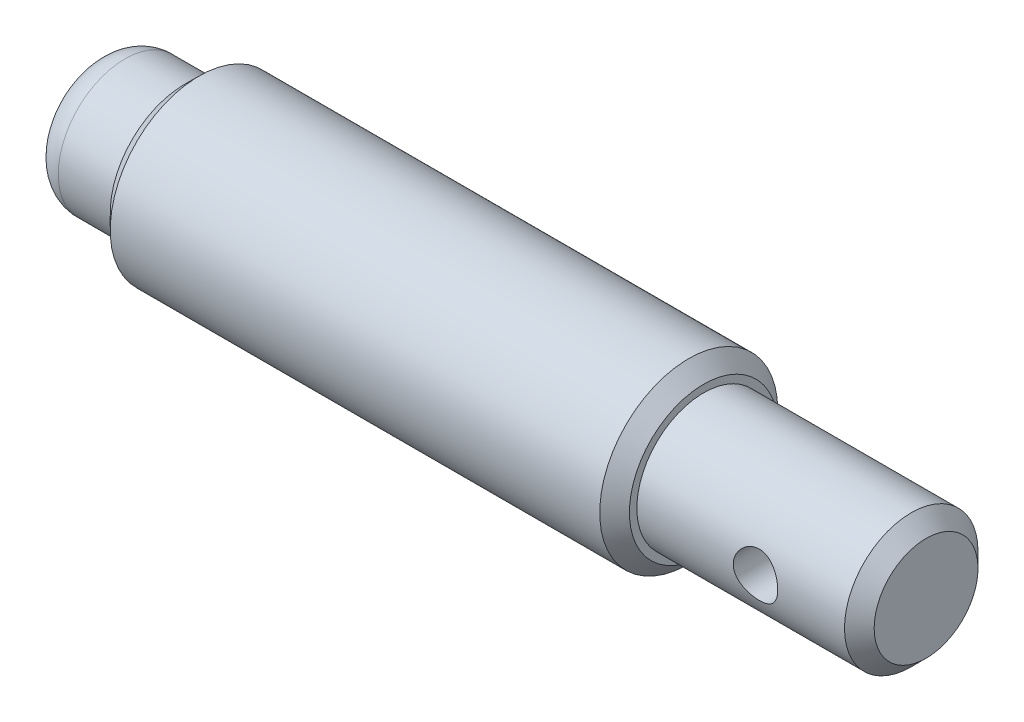
ISO-10303-21;
HEADER;
FILE_DESCRIPTION(('STEP AP214'),'2;1');
FILE_NAME('part.step','',(''),(''),'','','');
FILE_SCHEMA(('AUTOMOTIVE_DESIGN { 1 0 10303 214 1 1 1 1 }'));
ENDSEC;
DATA;
#1=APPLICATION_CONTEXT('core data for automotive mechanical design processes');
#2=APPLICATION_PROTOCOL_DEFINITION('international standard','automotive_design',2000,#1);
#3=PRODUCT_CONTEXT('',#1,'mechanical');
#4=PRODUCT('Part','Part','',(#3));
#5=PRODUCT_RELATED_PRODUCT_CATEGORY('part','',(#4));
#6=PRODUCT_DEFINITION_FORMATION('','',#4);
#7=PRODUCT_DEFINITION_CONTEXT('part definition',#1,'design');
#8=PRODUCT_DEFINITION('design','',#6,#7);
#9=PRODUCT_DEFINITION_SHAPE('','',#8);
#10=(LENGTH_UNIT() NAMED_UNIT(*) SI_UNIT(.MILLI.,.METRE.));
#11=(NAMED_UNIT(*) PLANE_ANGLE_UNIT() SI_UNIT($,.RADIAN.));
#12=(NAMED_UNIT(*) SI_UNIT($,.STERADIAN.) SOLID_ANGLE_UNIT());
#13=UNCERTAINTY_MEASURE_WITH_UNIT(LENGTH_MEASURE(1.E-05),#10,'distance_accuracy_value','');
#14=(GEOMETRIC_REPRESENTATION_CONTEXT(3) GLOBAL_UNCERTAINTY_ASSIGNED_CONTEXT((#13)) GLOBAL_UNIT_ASSIGNED_CONTEXT((#10,
#11,#12)) REPRESENTATION_CONTEXT('',''));
#15=CARTESIAN_POINT('',(0.,0.,0.));
#16=DIRECTION('',(0.,0.,1.));
#17=DIRECTION('',(1.,0.,0.));
#18=AXIS2_PLACEMENT_3D('',#15,#16,#17);
#19=CARTESIAN_POINT('',(0.,0.,0.));
#20=DIRECTION('',(-0.999999999999995,0.,0.));
#21=DIRECTION('',(0.,0.,0.999999999999995));
#22=AXIS2_PLACEMENT_3D('',#19,#20,#21);
#23=PLANE('',#22);
#24=CARTESIAN_POINT('',(0.,0.,0.));
#25=DIRECTION('',(-0.999999999999995,0.,0.));
#26=DIRECTION('',(0.,0.,0.999999999999995));
#27=AXIS2_PLACEMENT_3D('',#24,#25,#26);
#28=CIRCLE('',#27,2.5);
#29=CARTESIAN_POINT('',(0.,0.,2.49999999999999));
#30=VERTEX_POINT('',#29);
#31=EDGE_CURVE('E58',#30,#30,#28,.T.);
#32=ORIENTED_EDGE('',*,*,#31,.T.);
#33=EDGE_LOOP('',(#32));
#34=FACE_BOUND('',#33,.T.);
#35=ADVANCED_FACE('F45',(#34),#23,.T.);
#36=CARTESIAN_POINT('',(0.,0.,0.));
#37=DIRECTION('',(0.999999999999995,0.,0.));
#38=DIRECTION('',(0.,0.,-0.999999999999995));
#39=AXIS2_PLACEMENT_3D('',#36,#37,#38);
#40=CYLINDRICAL_SURFACE('',#39,4.5);
#41=CARTESIAN_POINT('',(1.99999999999979,0.,0.));
#42=DIRECTION('',(-0.999999999999995,0.,0.));
#43=DIRECTION('',(0.,0.,0.999999999999995));
#44=AXIS2_PLACEMENT_3D('',#41,#42,#43);
#45=CIRCLE('',#44,4.5);
#46=CARTESIAN_POINT('',(1.99999999999979,0.,-4.49999999999998));
#47=VERTEX_POINT('',#46);
#48=EDGE_CURVE('E62',#47,#47,#45,.F.);
#49=CARTESIAN_POINT('',(5.99999999999979,0.,0.));
#50=DIRECTION('',(0.999999999999995,0.,0.));
#51=DIRECTION('',(0.,0.,-0.999999999999995));
#52=AXIS2_PLACEMENT_3D('',#49,#50,#51);
#53=CIRCLE('',#52,4.5);
#54=CARTESIAN_POINT('',(5.99999999999979,0.,-4.49999999999998));
#55=VERTEX_POINT('',#54);
#56=EDGE_CURVE('E136',#55,#55,#53,.T.);
#57=CARTESIAN_POINT('',(1.99999999999979,0.,-4.49999999999998));
#58=CARTESIAN_POINT('',(2.04166666666645,0.,-4.49999999999998));
#59=CARTESIAN_POINT('',(2.08333333333312,0.,-4.49999999999998));
#60=CARTESIAN_POINT('',(2.16666666666645,0.,-4.49999999999998));
#61=CARTESIAN_POINT('',(2.20833333333312,0.,-4.49999999999998));
#62=CARTESIAN_POINT('',(2.29166666666645,0.,-4.49999999999998));
#63=CARTESIAN_POINT('',(2.33333333333312,0.,-4.49999999999998));
#64=CARTESIAN_POINT('',(2.41666666666645,0.,-4.49999999999998));
#65=CARTESIAN_POINT('',(2.45833333333312,0.,-4.49999999999998));
#66=CARTESIAN_POINT('',(2.54166666666645,0.,-4.49999999999998));
#67=CARTESIAN_POINT('',(2.58333333333312,0.,-4.49999999999998));
#68=CARTESIAN_POINT('',(2.66666666666645,0.,-4.49999999999998));
#69=CARTESIAN_POINT('',(2.70833333333312,0.,-4.49999999999998));
#70=CARTESIAN_POINT('',(2.79166666666645,0.,-4.49999999999998));
#71=CARTESIAN_POINT('',(2.83333333333312,0.,-4.49999999999998));
#72=CARTESIAN_POINT('',(2.91666666666645,0.,-4.49999999999998));
#73=CARTESIAN_POINT('',(2.95833333333312,0.,-4.49999999999998));
#74=CARTESIAN_POINT('',(3.04166666666645,0.,-4.49999999999998));
#75=CARTESIAN_POINT('',(3.08333333333312,0.,-4.49999999999998));
#76=CARTESIAN_POINT('',(3.16666666666645,0.,-4.49999999999998));
#77=CARTESIAN_POINT('',(3.20833333333312,0.,-4.49999999999998));
#78=CARTESIAN_POINT('',(3.29166666666645,0.,-4.49999999999998));
#79=CARTESIAN_POINT('',(3.33333333333312,0.,-4.49999999999998));
#80=CARTESIAN_POINT('',(3.41666666666645,0.,-4.49999999999998));
#81=CARTESIAN_POINT('',(3.45833333333312,0.,-4.49999999999998));
#82=CARTESIAN_POINT('',(3.54166666666645,0.,-4.49999999999998));
#83=CARTESIAN_POINT('',(3.58333333333312,0.,-4.49999999999998));
#84=CARTESIAN_POINT('',(3.66666666666645,0.,-4.49999999999998));
#85=CARTESIAN_POINT('',(3.70833333333312,0.,-4.49999999999998));
#86=CARTESIAN_POINT('',(3.79166666666645,0.,-4.49999999999998));
#87=CARTESIAN_POINT('',(3.83333333333312,0.,-4.49999999999998));
#88=CARTESIAN_POINT('',(3.91666666666645,0.,-4.49999999999998));
#89=CARTESIAN_POINT('',(3.95833333333312,0.,-4.49999999999998));
#90=CARTESIAN_POINT('',(4.04166666666645,0.,-4.49999999999998));
#91=CARTESIAN_POINT('',(4.08333333333312,0.,-4.49999999999998));
#92=CARTESIAN_POINT('',(4.16666666666645,0.,-4.49999999999998));
#93=CARTESIAN_POINT('',(4.20833333333312,0.,-4.49999999999998));
#94=CARTESIAN_POINT('',(4.29166666666645,0.,-4.49999999999998));
#95=CARTESIAN_POINT('',(4.33333333333312,0.,-4.49999999999998));
#96=CARTESIAN_POINT('',(4.41666666666645,0.,-4.49999999999998));
#97=CARTESIAN_POINT('',(4.45833333333312,0.,-4.49999999999998));
#98=CARTESIAN_POINT('',(4.54166666666645,0.,-4.49999999999998));
#99=CARTESIAN_POINT('',(4.58333333333312,0.,-4.49999999999998));
#100=CARTESIAN_POINT('',(4.66666666666645,0.,-4.49999999999998));
#101=CARTESIAN_POINT('',(4.70833333333312,0.,-4.49999999999998));
#102=CARTESIAN_POINT('',(4.79166666666645,0.,-4.49999999999998));
#103=CARTESIAN_POINT('',(4.83333333333312,0.,-4.49999999999998));
#104=CARTESIAN_POINT('',(4.91666666666645,0.,-4.49999999999998));
#105=CARTESIAN_POINT('',(4.95833333333312,0.,-4.49999999999998));
#106=CARTESIAN_POINT('',(5.04166666666645,0.,-4.49999999999998));
#107=CARTESIAN_POINT('',(5.08333333333312,0.,-4.49999999999998));
#108=CARTESIAN_POINT('',(5.16666666666645,0.,-4.49999999999998));
#109=CARTESIAN_POINT('',(5.20833333333312,0.,-4.49999999999998));
#110=CARTESIAN_POINT('',(5.29166666666645,0.,-4.49999999999998));
#111=CARTESIAN_POINT('',(5.33333333333312,0.,-4.49999999999998));
#112=CARTESIAN_POINT('',(5.41666666666645,0.,-4.49999999999998));
#113=CARTESIAN_POINT('',(5.45833333333312,0.,-4.49999999999998));
#114=CARTESIAN_POINT('',(5.54166666666645,0.,-4.49999999999998));
#115=CARTESIAN_POINT('',(5.58333333333312,0.,-4.49999999999998));
#116=CARTESIAN_POINT('',(5.66666666666645,0.,-4.49999999999998));
#117=CARTESIAN_POINT('',(5.70833333333312,0.,-4.49999999999998));
#118=CARTESIAN_POINT('',(5.79166666666645,0.,-4.49999999999998));
#119=CARTESIAN_POINT('',(5.83333333333312,0.,-4.49999999999998));
#120=CARTESIAN_POINT('',(5.91666666666645,0.,-4.49999999999998));
#121=CARTESIAN_POINT('',(5.95833333333312,0.,-4.49999999999998));
#122=CARTESIAN_POINT('',(5.99999999999979,0.,-4.49999999999998));
#123=B_SPLINE_CURVE_WITH_KNOTS('',3,(#57,#58,#59,#60,#61,#62,#63,#64,#65,#66,#67,#68,#69,#70,
#71,#72,#73,#74,#75,#76,#77,#78,#79,#80,#81,#82,#83,#84,#85,#86,#87,#88,#89,#90,#91,#92,#93,#94,
#95,#96,#97,#98,#99,#100,#101,#102,#103,#104,#105,#106,#107,#108,#109,#110,#111,#112,#113,#114,
#115,#116,#117,#118,#119,#120,#121,#122),.UNSPECIFIED.,.F.,.F.,(4,2,2,2,2,2,2,2,2,2,2,2,2,2,2,2,
2,2,2,2,2,2,2,2,2,2,2,2,2,2,2,2,4),(0.,0.125,0.25,0.375,0.5,0.625,0.75,0.875,1.,1.125,1.25,
1.375,1.5,1.625,1.75,1.875,2.,2.125,2.25,2.375,2.5,2.625,2.75,2.875,3.,3.125,3.25,3.375,3.5,
3.625,3.75,3.875,4.),.UNSPECIFIED.);
#124=EDGE_CURVE('BSEAM92',#47,#55,#123,.T.);
#125=ORIENTED_EDGE('',*,*,#48,.T.);
#126=ORIENTED_EDGE('',*,*,#56,.F.);
#127=ORIENTED_EDGE('',*,*,#124,.T.);
#128=ORIENTED_EDGE('',*,*,#124,.F.);
#129=EDGE_LOOP('',(#125,#127,#126,#128));
#130=FACE_BOUND('',#129,.T.);
#131=ADVANCED_FACE('F92',(#130),#40,.T.);
#132=CARTESIAN_POINT('',(5.99999999999979,4.5,0.));
#133=DIRECTION('',(-0.999999999999995,0.,0.));
#134=DIRECTION('',(0.,0.,0.999999999999995));
#135=AXIS2_PLACEMENT_3D('',#132,#133,#134);
#136=PLANE('',#135);
#137=CARTESIAN_POINT('',(5.99999999999979,0.,0.));
#138=DIRECTION('',(-0.999999999999995,0.,0.));
#139=DIRECTION('',(0.,0.,0.999999999999995));
#140=AXIS2_PLACEMENT_3D('',#137,#138,#139);
#141=CIRCLE('',#140,5.00000000000001);
#142=CARTESIAN_POINT('',(5.99999999999979,0.,-4.99999999999998));
#143=VERTEX_POINT('',#142);
#144=EDGE_CURVE('E115',#143,#143,#141,.T.);
#145=ORIENTED_EDGE('',*,*,#144,.T.);
#146=EDGE_LOOP('',(#145));
#147=FACE_BOUND('',#146,.T.);
#148=ORIENTED_EDGE('',*,*,#56,.T.);
#149=EDGE_LOOP('',(#148));
#150=FACE_BOUND('',#149,.T.);
#151=ADVANCED_FACE('F98',(#147,#150),#136,.T.);
#152=CARTESIAN_POINT('',(0.,0.,0.));
#153=DIRECTION('',(0.999999999999995,0.,0.));
#154=DIRECTION('',(0.,0.,-0.999999999999995));
#155=AXIS2_PLACEMENT_3D('',#152,#153,#154);
#156=CYLINDRICAL_SURFACE('',#155,6.);
#157=CARTESIAN_POINT('',(39.9999999999997,0.,0.));
#158=DIRECTION('',(0.999999999999995,0.,0.));
#159=DIRECTION('',(0.,0.,-0.999999999999995));
#160=AXIS2_PLACEMENT_3D('',#157,#158,#159);
#161=CIRCLE('',#160,6.);
#162=CARTESIAN_POINT('',(39.9999999999997,0.,-5.99999999999997));
#163=VERTEX_POINT('',#162);
#164=EDGE_CURVE('E120',#163,#163,#161,.F.);
#165=CARTESIAN_POINT('',(6.99999999999978,0.,0.));
#166=DIRECTION('',(-0.999999999999995,0.,0.));
#167=DIRECTION('',(0.,0.,0.999999999999995));
#168=AXIS2_PLACEMENT_3D('',#165,#166,#167);
#169=CIRCLE('',#168,6.);
#170=CARTESIAN_POINT('',(6.99999999999978,0.,-5.99999999999997));
#171=VERTEX_POINT('',#170);
#172=EDGE_CURVE('E118',#171,#171,#169,.F.);
#173=CARTESIAN_POINT('',(39.9999999999997,0.,-5.99999999999997));
#174=CARTESIAN_POINT('',(39.6562499999997,0.,-5.99999999999997));
#175=CARTESIAN_POINT('',(39.3124999999997,0.,-5.99999999999997));
#176=CARTESIAN_POINT('',(38.6249999999997,0.,-5.99999999999997));
#177=CARTESIAN_POINT('',(38.2812499999997,0.,-5.99999999999997));
#178=CARTESIAN_POINT('',(37.5937499999997,0.,-5.99999999999997));
#179=CARTESIAN_POINT('',(37.2499999999997,0.,-5.99999999999997));
#180=CARTESIAN_POINT('',(36.5624999999997,0.,-5.99999999999997));
#181=CARTESIAN_POINT('',(36.2187499999997,0.,-5.99999999999997));
#182=CARTESIAN_POINT('',(35.5312499999997,0.,-5.99999999999997));
#183=CARTESIAN_POINT('',(35.1874999999997,0.,-5.99999999999997));
#184=CARTESIAN_POINT('',(34.4999999999997,0.,-5.99999999999997));
#185=CARTESIAN_POINT('',(34.1562499999997,0.,-5.99999999999997));
#186=CARTESIAN_POINT('',(33.4687499999997,0.,-5.99999999999997));
#187=CARTESIAN_POINT('',(33.1249999999997,0.,-5.99999999999997));
#188=CARTESIAN_POINT('',(32.4374999999997,0.,-5.99999999999997));
#189=CARTESIAN_POINT('',(32.0937499999997,0.,-5.99999999999997));
#190=CARTESIAN_POINT('',(31.4062499999997,0.,-5.99999999999997));
#191=CARTESIAN_POINT('',(31.0624999999997,0.,-5.99999999999997));
#192=CARTESIAN_POINT('',(30.3749999999997,0.,-5.99999999999997));
#193=CARTESIAN_POINT('',(30.0312499999997,0.,-5.99999999999997));
#194=CARTESIAN_POINT('',(29.3437499999997,0.,-5.99999999999997));
#195=CARTESIAN_POINT('',(28.9999999999997,0.,-5.99999999999997));
#196=CARTESIAN_POINT('',(28.3124999999997,0.,-5.99999999999997));
#197=CARTESIAN_POINT('',(27.9687499999997,0.,-5.99999999999997));
#198=CARTESIAN_POINT('',(27.2812499999997,0.,-5.99999999999997));
#199=CARTESIAN_POINT('',(26.9374999999997,0.,-5.99999999999997));
#200=CARTESIAN_POINT('',(26.2499999999997,0.,-5.99999999999997));
#201=CARTESIAN_POINT('',(25.9062499999997,0.,-5.99999999999997));
#202=CARTESIAN_POINT('',(25.2187499999997,0.,-5.99999999999997));
#203=CARTESIAN_POINT('',(24.8749999999997,0.,-5.99999999999997));
#204=CARTESIAN_POINT('',(24.1874999999997,0.,-5.99999999999997));
#205=CARTESIAN_POINT('',(23.8437499999997,0.,-5.99999999999997));
#206=CARTESIAN_POINT('',(23.1562499999997,0.,-5.99999999999997));
#207=CARTESIAN_POINT('',(22.8124999999997,0.,-5.99999999999997));
#208=CARTESIAN_POINT('',(22.1249999999997,0.,-5.99999999999997));
#209=CARTESIAN_POINT('',(21.7812499999997,0.,-5.99999999999997));
#210=CARTESIAN_POINT('',(21.0937499999997,0.,-5.99999999999997));
#211=CARTESIAN_POINT('',(20.7499999999997,0.,-5.99999999999997));
#212=CARTESIAN_POINT('',(20.0624999999997,0.,-5.99999999999997));
#213=CARTESIAN_POINT('',(19.7187499999997,0.,-5.99999999999997));
#214=CARTESIAN_POINT('',(19.0312499999997,0.,-5.99999999999997));
#215=CARTESIAN_POINT('',(18.6874999999997,0.,-5.99999999999997));
#216=CARTESIAN_POINT('',(17.9999999999997,0.,-5.99999999999997));
#217=CARTESIAN_POINT('',(17.6562499999997,0.,-5.99999999999997));
#218=CARTESIAN_POINT('',(16.9687499999997,0.,-5.99999999999997));
#219=CARTESIAN_POINT('',(16.6249999999997,0.,-5.99999999999997));
#220=CARTESIAN_POINT('',(15.9374999999997,0.,-5.99999999999997));
#221=CARTESIAN_POINT('',(15.5937499999997,0.,-5.99999999999997));
#222=CARTESIAN_POINT('',(14.9062499999997,0.,-5.99999999999997));
#223=CARTESIAN_POINT('',(14.5624999999997,0.,-5.99999999999997));
#224=CARTESIAN_POINT('',(13.8749999999997,0.,-5.99999999999997));
#225=CARTESIAN_POINT('',(13.5312499999998,0.,-5.99999999999997));
#226=CARTESIAN_POINT('',(12.8437499999998,0.,-5.99999999999997));
#227=CARTESIAN_POINT('',(12.4999999999998,0.,-5.99999999999997));
#228=CARTESIAN_POINT('',(11.8124999999998,0.,-5.99999999999997));
#229=CARTESIAN_POINT('',(11.4687499999998,0.,-5.99999999999997));
#230=CARTESIAN_POINT('',(10.7812499999998,0.,-5.99999999999997));
#231=CARTESIAN_POINT('',(10.4374999999998,0.,-5.99999999999997));
#232=CARTESIAN_POINT('',(9.74999999999976,0.,-5.99999999999997));
#233=CARTESIAN_POINT('',(9.40624999999977,0.,-5.99999999999997));
#234=CARTESIAN_POINT('',(8.71874999999977,0.,-5.99999999999997));
#235=CARTESIAN_POINT('',(8.37499999999977,0.,-5.99999999999997));
#236=CARTESIAN_POINT('',(7.68749999999977,0.,-5.99999999999997));
#237=CARTESIAN_POINT('',(7.34374999999977,0.,-5.99999999999997));
#238=CARTESIAN_POINT('',(6.99999999999977,0.,-5.99999999999997));
#239=B_SPLINE_CURVE_WITH_KNOTS('',3,(#173,#174,#175,#176,#177,#178,#179,#180,#181,#182,#183,
#184,#185,#186,#187,#188,#189,#190,#191,#192,#193,#194,#195,#196,#197,#198,#199,#200,#201,#202,
#203,#204,#205,#206,#207,#208,#209,#210,#211,#212,#213,#214,#215,#216,#217,#218,#219,#220,#221,
#222,#223,#224,#225,#226,#227,#228,#229,#230,#231,#232,#233,#234,#235,#236,#237,#238),
.UNSPECIFIED.,.F.,.F.,(4,2,2,2,2,2,2,2,2,2,2,2,2,2,2,2,2,2,2,2,2,2,2,2,2,2,2,2,2,2,2,2,4),(0.,
1.03125,2.06249999999999,3.09374999999999,4.12499999999998,5.15624999999998,6.18749999999998,
7.21874999999997,8.24999999999997,9.28124999999996,10.3125,11.34375,12.375,13.40625,
14.4374999999999,15.4687499999999,16.4999999999999,17.5312499999999,18.5624999999999,
19.5937499999999,20.6249999999999,21.6562499999999,22.6874999999999,23.7187499999999,
24.7499999999999,25.7812499999999,26.8124999999999,27.8437499999999,28.8749999999999,
29.9062499999999,30.9374999999999,31.9687499999999,32.9999999999999),.UNSPECIFIED.);
#240=EDGE_CURVE('BSEAM153',#163,#171,#239,.T.);
#241=ORIENTED_EDGE('',*,*,#164,.T.);
#242=ORIENTED_EDGE('',*,*,#172,.T.);
#243=ORIENTED_EDGE('',*,*,#240,.T.);
#244=ORIENTED_EDGE('',*,*,#240,.F.);
#245=EDGE_LOOP('',(#241,#243,#242,#244));
#246=FACE_BOUND('',#245,.T.);
#247=ADVANCED_FACE('F153',(#246),#156,.T.);
#248=CARTESIAN_POINT('',(40.9999999999997,6.00000000000002,0.));
#249=DIRECTION('',(0.999999999999995,0.,0.));
#250=DIRECTION('',(0.,0.,-0.999999999999995));
#251=AXIS2_PLACEMENT_3D('',#248,#249,#250);
#252=PLANE('',#251);
#253=CARTESIAN_POINT('',(40.9999999999997,0.,0.));
#254=DIRECTION('',(0.999999999999995,0.,0.));
#255=DIRECTION('',(0.,0.,-0.999999999999995));
#256=AXIS2_PLACEMENT_3D('',#253,#254,#255);
#257=CIRCLE('',#256,5.);
#258=CARTESIAN_POINT('',(40.9999999999997,0.,-4.99999999999998));
#259=VERTEX_POINT('',#258);
#260=EDGE_CURVE('E121',#259,#259,#257,.T.);
#261=ORIENTED_EDGE('',*,*,#260,.T.);
#262=EDGE_LOOP('',(#261));
#263=FACE_BOUND('',#262,.T.);
#264=CARTESIAN_POINT('',(40.9999999999997,0.,0.));
#265=DIRECTION('',(0.999999999999995,0.,0.));
#266=DIRECTION('',(0.,0.,-0.999999999999995));
#267=AXIS2_PLACEMENT_3D('',#264,#265,#266);
#268=CIRCLE('',#267,4.5);
#269=CARTESIAN_POINT('',(40.9999999999997,0.,-4.49999999999999));
#270=VERTEX_POINT('',#269);
#271=EDGE_CURVE('E139',#270,#270,#268,.T.);
#272=ORIENTED_EDGE('',*,*,#271,.F.);
#273=EDGE_LOOP('',(#272));
#274=FACE_BOUND('',#273,.T.);
#275=ADVANCED_FACE('F88',(#263,#274),#252,.T.);
#276=CARTESIAN_POINT('',(0.,0.,0.));
#277=DIRECTION('',(0.999999999999995,0.,0.));
#278=DIRECTION('',(0.,0.,-0.999999999999995));
#279=AXIS2_PLACEMENT_3D('',#276,#277,#278);
#280=CYLINDRICAL_SURFACE('',#279,4.5);
#281=CARTESIAN_POINT('',(47.4999999999997,0.,-4.50000000000002));
#282=CARTESIAN_POINT('',(47.4999996194022,0.0818450443301806,-4.50000022951418));
#283=CARTESIAN_POINT('',(47.5067203991903,0.163687791807919,-4.49774654261318));
#284=CARTESIAN_POINT('',(47.5333436632253,0.324962641309505,-4.48897815304921));
#285=CARTESIAN_POINT('',(47.553247515923,0.404394492178228,-4.48246300803229));
#286=CARTESIAN_POINT('',(47.6054788650757,0.558499184252642,-4.46587961859665));
#287=CARTESIAN_POINT('',(47.6377855936884,0.633179738829052,-4.45581731596281));
#288=CARTESIAN_POINT('',(47.713811759257,0.776062405207927,-4.43316668576013));
#289=CARTESIAN_POINT('',(47.7575334475034,0.844263235437915,-4.42057786001667));
#290=CARTESIAN_POINT('',(47.8567387072877,0.974612512533247,-4.39371141664508));
#291=CARTESIAN_POINT('',(47.9125468513902,1.03650555044738,-4.37939334695679));
#292=CARTESIAN_POINT('',(48.0336507320593,1.15024903905308,-4.35090472174684));
#293=CARTESIAN_POINT('',(48.0989485523923,1.20209727823411,-4.33673419935825));
#294=CARTESIAN_POINT('',(48.2394776727942,1.29573741334171,-4.30969998715911));
#295=CARTESIAN_POINT('',(48.3149406095977,1.33719728733152,-4.29688558913533));
#296=CARTESIAN_POINT('',(48.4722641416873,1.40672831081659,-4.27462958127903));
#297=CARTESIAN_POINT('',(48.5541227757436,1.43480354608014,-4.2651869424112));
#298=CARTESIAN_POINT('',(48.7190098322446,1.47581019226373,-4.25116954904067));
#299=CARTESIAN_POINT('',(48.8019058127331,1.48922017240764,-4.24644143654418));
#300=CARTESIAN_POINT('',(48.9688956312333,1.50201168500171,-4.24193484944262));
#301=CARTESIAN_POINT('',(49.0529890910633,1.50139755240707,-4.24215484534096));
#302=CARTESIAN_POINT('',(49.2159049456655,1.48652985555512,-4.24738522512271));
#303=CARTESIAN_POINT('',(49.294792604378,1.47290086975049,-4.252176238013));
#304=CARTESIAN_POINT('',(49.4490901294098,1.43340924427412,-4.26564986586827));
#305=CARTESIAN_POINT('',(49.5244995781521,1.4075451398878,-4.27433294676163));
#306=CARTESIAN_POINT('',(49.6711191243867,1.3439085870903,-4.29476866696874));
#307=CARTESIAN_POINT('',(49.7422420382038,1.30595107306089,-4.30656848689677));
#308=CARTESIAN_POINT('',(49.8773063624191,1.2193336594547,-4.3318883786359));
#309=CARTESIAN_POINT('',(49.9412456903996,1.17067066854599,-4.34540894685696));
#310=CARTESIAN_POINT('',(50.0636373972407,1.06102399902334,-4.37350993751612));
#311=CARTESIAN_POINT('',(50.1216290417631,0.99952972511446,-4.38810884032265));
#312=CARTESIAN_POINT('',(50.2265968999946,0.867509354955093,-4.41610407580556));
#313=CARTESIAN_POINT('',(50.2735720572462,0.796982393491217,-4.42950029307102));
#314=CARTESIAN_POINT('',(50.3555444503521,0.647921419569397,-4.45375661906692));
#315=CARTESIAN_POINT('',(50.3904182370106,0.569314914624501,-4.4645902501206));
#316=CARTESIAN_POINT('',(50.4463047609331,0.40690362504676,-4.48230850716653));
#317=CARTESIAN_POINT('',(50.4673223131346,0.32310065723243,-4.48919450482319));
#318=CARTESIAN_POINT('',(50.494083499033,0.156575744293983,-4.49801440607161));
#319=CARTESIAN_POINT('',(50.5004497137586,0.0739643997973231,-4.50015002750593));
#320=CARTESIAN_POINT('',(50.4995009896018,-0.0911626049402473,-4.49983354042242));
#321=CARTESIAN_POINT('',(50.4921883600297,-0.173678278979339,-4.49738220629044));
#322=CARTESIAN_POINT('',(50.4645821383956,-0.333779799456253,-4.48830037075657));
#323=CARTESIAN_POINT('',(50.4446706909253,-0.411439210252167,-4.4817929806679));
#324=CARTESIAN_POINT('',(50.3929098332994,-0.562283937869318,-4.46537770245106));
#325=CARTESIAN_POINT('',(50.3610589007978,-0.63546868276289,-4.45546938070013));
#326=CARTESIAN_POINT('',(50.2853943522383,-0.777432444589914,-4.43293396930935));
#327=CARTESIAN_POINT('',(50.2412881100747,-0.846044938825727,-4.42024222133679));
#328=CARTESIAN_POINT('',(50.1427087749793,-0.975097245203399,-4.39357880874394));
#329=CARTESIAN_POINT('',(50.0882325159518,-1.03553455169339,-4.37960675390742));
#330=CARTESIAN_POINT('',(49.9675318734896,-1.14937876170947,-4.35115271970668));
#331=CARTESIAN_POINT('',(49.9008861596092,-1.20234145386867,-4.33667641631142));
#332=CARTESIAN_POINT('',(49.7593426482832,-1.29638628348536,-4.30949959942063));
#333=CARTESIAN_POINT('',(49.6844447820484,-1.33746832189652,-4.29679910073004));
#334=CARTESIAN_POINT('',(49.5284904770646,-1.40639539562454,-4.27473587687076));
#335=CARTESIAN_POINT('',(49.4474468812463,-1.43426719824753,-4.26536641189469));
#336=CARTESIAN_POINT('',(49.2814320249333,-1.47584200013903,-4.25116248459675));
#337=CARTESIAN_POINT('',(49.196462551893,-1.48955138243089,-4.2463259793546));
#338=CARTESIAN_POINT('',(49.0297043559381,-1.50191442371601,-4.24196788311267));
#339=CARTESIAN_POINT('',(48.9479764895692,-1.50130538596262,-4.24218600386123));
#340=CARTESIAN_POINT('',(48.7858523876164,-1.486863440173,-4.24726904735802));
#341=CARTESIAN_POINT('',(48.7054560730669,-1.47303131918775,-4.25213369354043));
#342=CARTESIAN_POINT('',(48.5497965054958,-1.4330577196939,-4.26576786457339));
#343=CARTESIAN_POINT('',(48.4744647624927,-1.40715501902325,-4.27446147033718));
#344=CARTESIAN_POINT('',(48.3291588895921,-1.34396904863959,-4.29474598227704));
#345=CARTESIAN_POINT('',(48.2591859532175,-1.30668325283057,-4.3063375314509));
#346=CARTESIAN_POINT('',(48.1232744951151,-1.21989103887497,-4.3317424383907));
#347=CARTESIAN_POINT('',(48.0576452471519,-1.16992236414679,-4.34563067463207));
#348=CARTESIAN_POINT('',(47.9354652799232,-1.05996432470347,-4.37375034424881));
#349=CARTESIAN_POINT('',(47.8789171364674,-0.999972126677209,-4.38798187368559));
#350=CARTESIAN_POINT('',(47.7742833815657,-0.868862335381034,-4.41585045788316));
#351=CARTESIAN_POINT('',(47.726613478373,-0.797402270249627,-4.42944272701885));
#352=CARTESIAN_POINT('',(47.6440143567236,-0.647036036109966,-4.45388986758918));
#353=CARTESIAN_POINT('',(47.6090818811166,-0.568131777198515,-4.46474543861893));
#354=CARTESIAN_POINT('',(47.5544175512666,-0.408740470801434,-4.48208272602811));
#355=CARTESIAN_POINT('',(47.5340763006044,-0.328481636514595,-4.48873818633784));
#356=CARTESIAN_POINT('',(47.5068695789838,-0.165480624015333,-4.49769610596334));
#357=CARTESIAN_POINT('',(47.5000003847549,-0.0827391383530521,-4.4999997679786));
#358=CARTESIAN_POINT('',(47.4999999999997,0.,-4.50000000000002));
#359=B_SPLINE_CURVE_WITH_KNOTS('',3,(#281,#282,#283,#284,#285,#286,#287,#288,#289,#290,#291,
#292,#293,#294,#295,#296,#297,#298,#299,#300,#301,#302,#303,#304,#305,#306,#307,#308,#309,#310,
#311,#312,#313,#314,#315,#316,#317,#318,#319,#320,#321,#322,#323,#324,#325,#326,#327,#328,#329,
#330,#331,#332,#333,#334,#335,#336,#337,#338,#339,#340,#341,#342,#343,#344,#345,#346,#347,#348,
#349,#350,#351,#352,#353,#354,#355,#356,#357,#358),.UNSPECIFIED.,.T.,.F.,(4,2,2,2,2,2,2,2,2,2,2,
2,2,2,2,2,2,2,2,2,2,2,2,2,2,2,2,2,2,2,2,2,2,2,2,2,2,2,4),(0.,0.245230659038978,0.49048677790121,
0.735334009305243,0.98022956669838,1.2327702642411,1.48536649931275,1.74522577235187,
2.00500567039233,2.25602888612742,2.50697450981211,2.74645239826903,2.98595896283207,
3.22932256732679,3.47275653837293,3.72889958717033,3.9850671894991,4.24377608475519,
4.50239503315794,4.74980374762728,4.99717069746231,5.23737236967294,5.47760467926138,
5.72415599765588,5.97078271232821,6.2286153432111,6.48645012352477,6.74376020740138,
7.00095427058741,7.2449349909637,7.48890119027045,7.7282338062061,7.96761957263953,
8.21745100037688,8.46735316685644,8.72699491252622,8.98657021728654,9.23454837560697,
9.48245799057191),.UNSPECIFIED.);
#360=CARTESIAN_POINT('',(47.4999999999997,0.,-4.50000000000002));
#361=VERTEX_POINT('',#360);
#362=EDGE_CURVE('E49',#361,#361,#359,.T.);
#363=ORIENTED_EDGE('',*,*,#362,.F.);
#364=EDGE_LOOP('',(#363));
#365=FACE_BOUND('',#364,.T.);
#366=CARTESIAN_POINT('',(48.9999999999995,-1.50000000000002,4.24264068711925));
#367=CARTESIAN_POINT('',(49.0817022622536,-1.50000038692158,4.24264041795647));
#368=CARTESIAN_POINT('',(49.1634021997349,-1.49330217552828,4.24502653936287));
#369=CARTESIAN_POINT('',(49.3243816314909,-1.46677669753321,4.25426361121883));
#370=CARTESIAN_POINT('',(49.4036607248082,-1.4469472682526,4.2611152971328));
#371=CARTESIAN_POINT('',(49.5574403394954,-1.39493322852737,4.27842305533184));
#372=CARTESIAN_POINT('',(49.6319498941636,-1.36277283210488,4.28887205956983));
#373=CARTESIAN_POINT('',(49.7745400728214,-1.28709244266205,4.31218683015488));
#374=CARTESIAN_POINT('',(49.8426192738299,-1.24356994329023,4.32505312955415));
#375=CARTESIAN_POINT('',(49.973079943507,-1.14457671966427,4.35231734111206));
#376=CARTESIAN_POINT('',(50.0351731430071,-1.08873651206686,4.36675342266967));
#377=CARTESIAN_POINT('',(50.1493102018365,-0.9674815008216,4.39520797201505));
#378=CARTESIAN_POINT('',(50.2013524473731,-0.902065162578566,4.40922637243438));
#379=CARTESIAN_POINT('',(50.2952183459939,-0.761406761947519,4.43570800382694));
#380=CARTESIAN_POINT('',(50.3367399559264,-0.685952866836799,4.44812111552409));
#381=CARTESIAN_POINT('',(50.4063873776907,-0.528646834481225,4.46954380156474));
#382=CARTESIAN_POINT('',(50.4345167997649,-0.446796428530827,4.47855429304498));
#383=CARTESIAN_POINT('',(50.4756037819481,-0.282043226150241,4.49188613147856));
#384=CARTESIAN_POINT('',(50.489055169385,-0.199276132279447,4.49635972166341));
#385=CARTESIAN_POINT('',(50.5019744400405,-0.0325468122361193,4.5006541232737));
#386=CARTESIAN_POINT('',(50.5014459274781,0.0514151003158628,4.50047613394332));
#387=CARTESIAN_POINT('',(50.4867336181504,0.214655272790751,4.49559059428101));
#388=CARTESIAN_POINT('',(50.4730862072877,0.293988072887521,4.49106097132703));
#389=CARTESIAN_POINT('',(50.4334105285288,0.449165158233238,4.47820451009571));
#390=CARTESIAN_POINT('',(50.4073814215299,0.525009206668743,4.46987741446669));
#391=CARTESIAN_POINT('',(50.3433680240403,0.672228712262986,4.45013505439934));
#392=CARTESIAN_POINT('',(50.3052310921794,0.743532331453468,4.43868063786406));
#393=CARTESIAN_POINT('',(50.2182104418269,0.878886488290672,4.41387589557999));
#394=CARTESIAN_POINT('',(50.1693237350095,0.942935001577016,4.40052504300774));
#395=CARTESIAN_POINT('',(50.0594884098084,1.06515129982773,4.37259287776332));
#396=CARTESIAN_POINT('',(49.9980802632314,1.12290023560127,4.35798322759002));
#397=CARTESIAN_POINT('',(49.8663269114156,1.22741588939381,4.32971002867668));
#398=CARTESIAN_POINT('',(49.7959803314297,1.27418091490945,4.31604662597172));
#399=CARTESIAN_POINT('',(49.6470195615764,1.35598118256404,4.29105787703293));
#400=CARTESIAN_POINT('',(49.5683018029478,1.39083969547655,4.27976864008232));
#401=CARTESIAN_POINT('',(49.4056429086001,1.44666478994927,4.26122476317449));
#402=CARTESIAN_POINT('',(49.3217039781668,1.46763719363329,4.25396843251832));
#403=CARTESIAN_POINT('',(49.1550424668986,1.49424192313571,4.24469454453103));
#404=CARTESIAN_POINT('',(49.0724358628809,1.50052364325862,4.24245540472709));
#405=CARTESIAN_POINT('',(48.907335776324,1.49940815836739,4.24285008094201));
#406=CARTESIAN_POINT('',(48.8248422759624,1.49201343784085,4.2454830118915));
#407=CARTESIAN_POINT('',(48.6652645514328,1.46433847732771,4.25510427134066));
#408=CARTESIAN_POINT('',(48.5880918547735,1.44450959097082,4.26193988160891));
#409=CARTESIAN_POINT('',(48.4381845906404,1.3930707938409,4.27902830506905));
#410=CARTESIAN_POINT('',(48.3654508126133,1.36145879454518,4.28928172402358));
#411=CARTESIAN_POINT('',(48.2239293687291,1.28621151110835,4.31245316393574));
#412=CARTESIAN_POINT('',(48.1553400360369,1.24222667753773,4.32544538498415));
#413=CARTESIAN_POINT('',(48.0262809214239,1.14387844583637,4.35248653096475));
#414=CARTESIAN_POINT('',(47.9658135420077,1.08951198824822,4.36653576665695));
#415=CARTESIAN_POINT('',(47.8517080238636,0.968837558850533,4.39492557956761));
#416=CARTESIAN_POINT('',(47.7985384149713,0.902080905820019,4.40924765366842));
#417=CARTESIAN_POINT('',(47.7041257864775,0.760240937100436,4.43590277419665));
#418=CARTESIAN_POINT('',(47.6628823432559,0.685157917296892,4.44823589126539));
#419=CARTESIAN_POINT('',(47.5938698427069,0.529169793648525,4.469466087159));
#420=CARTESIAN_POINT('',(47.5660130842774,0.448306684981881,4.47838545006796));
#421=CARTESIAN_POINT('',(47.5244083869094,0.282687698769101,4.49187916256662));
#422=CARTESIAN_POINT('',(47.5106553551789,0.197933237930897,4.49645508051024));
#423=CARTESIAN_POINT('',(47.4981068835912,0.0312230037900923,4.50062794854381));
#424=CARTESIAN_POINT('',(47.4986388191009,-0.0506770858800164,4.50044880134159));
#425=CARTESIAN_POINT('',(47.5129859622191,-0.21316671750026,4.49568294779097));
#426=CARTESIAN_POINT('',(47.5268000922288,-0.293756365228575,4.4910965990036));
#427=CARTESIAN_POINT('',(47.5668733518636,-0.45006317914809,4.47811372431615));
#428=CARTESIAN_POINT('',(47.592931323029,-0.525837406369207,4.46977887541723));
#429=CARTESIAN_POINT('',(47.6565662966452,-0.671967526409717,4.45015741056742));
#430=CARTESIAN_POINT('',(47.694145382795,-0.742322436213651,4.4388702607202));
#431=CARTESIAN_POINT('',(47.7813542681525,-0.878451024463167,4.41398803241816));
#432=CARTESIAN_POINT('',(47.831378028072,-0.943959377336405,4.4003230873789));
#433=CARTESIAN_POINT('',(47.9413860867338,-1.06587153940867,4.3723948318782));
#434=CARTESIAN_POINT('',(48.0013735633936,-1.12227243243695,4.35813133159642));
#435=CARTESIAN_POINT('',(48.1324140333799,-1.22661271324973,4.32994919738394));
#436=CARTESIAN_POINT('',(48.2038082664645,-1.27413444899687,4.31606591982947));
#437=CARTESIAN_POINT('',(48.3540016403537,-1.35647151495166,4.29090289984523));
#438=CARTESIAN_POINT('',(48.432798839544,-1.39129016522921,4.2796224774187));
#439=CARTESIAN_POINT('',(48.5919427360229,-1.44576574230625,4.26152001309768));
#440=CARTESIAN_POINT('',(48.6720583952876,-1.46603686372427,4.25451949285774));
#441=CARTESIAN_POINT('',(48.8347840756996,-1.4931514802239,4.24508075309278));
#442=CARTESIAN_POINT('',(48.9173932261156,-1.4999996087949,4.24264095926188));
#443=CARTESIAN_POINT('',(48.9999999999995,-1.50000000000002,4.24264068711925));
#444=B_SPLINE_CURVE_WITH_KNOTS('',3,(#366,#367,#368,#369,#370,#371,#372,#373,#374,#375,#376,
#377,#378,#379,#380,#381,#382,#383,#384,#385,#386,#387,#388,#389,#390,#391,#392,#393,#394,#395,
#396,#397,#398,#399,#400,#401,#402,#403,#404,#405,#406,#407,#408,#409,#410,#411,#412,#413,#414,
#415,#416,#417,#418,#419,#420,#421,#422,#423,#424,#425,#426,#427,#428,#429,#430,#431,#432,#433,
#434,#435,#436,#437,#438,#439,#440,#441,#442,#443),.UNSPECIFIED.,.T.,.F.,(4,2,2,2,2,2,2,2,2,2,2,
2,2,2,2,2,2,2,2,2,2,2,2,2,2,2,2,2,2,2,2,2,2,2,2,2,2,2,4),(0.,0.244800877199034,
0.489642082522735,0.734004941251242,0.978421749278179,1.23152006141352,1.4846589775798,
1.74440259215483,2.00407614580181,2.25471478147401,2.50528879953493,2.74603507238353,
2.98679766283852,3.23072482290494,3.4747198781102,3.73020261545866,3.98572469418152,
4.24488959763,4.50394577031471,4.75131437043206,4.99863803752397,5.23746593649711,
5.47633618716965,5.72278286600116,5.96930228489733,6.2276821225318,6.48605278132838,
6.74270686782815,6.99926824502773,7.24377127012996,7.48825446011219,7.72885434057189,
7.96949776141404,8.21903279277494,8.46864756645493,8.7280335410076,8.98735167396841,
9.23494818240578,9.48245920782237),.UNSPECIFIED.);
#445=CARTESIAN_POINT('',(48.9999999999995,-1.50000000000002,4.24264068711925));
#446=VERTEX_POINT('',#445);
#447=EDGE_CURVE('E10',#446,#446,#444,.T.);
#448=ORIENTED_EDGE('',*,*,#447,.F.);
#449=EDGE_LOOP('',(#448));
#450=FACE_BOUND('',#449,.T.);
#451=CARTESIAN_POINT('',(54.9999999999995,0.,0.));
#452=DIRECTION('',(0.999999999999995,0.,0.));
#453=DIRECTION('',(0.,0.,-0.999999999999995));
#454=AXIS2_PLACEMENT_3D('',#451,#452,#453);
#455=CIRCLE('',#454,4.5);
#456=CARTESIAN_POINT('',(54.9999999999995,0.,4.49999999999996));
#457=VERTEX_POINT('',#456);
#458=EDGE_CURVE('E126',#457,#457,#455,.F.);
#459=ORIENTED_EDGE('',*,*,#458,.T.);
#460=EDGE_LOOP('',(#459));
#461=FACE_BOUND('',#460,.T.);
#462=ORIENTED_EDGE('',*,*,#271,.T.);
#463=EDGE_LOOP('',(#462));
#464=FACE_BOUND('',#463,.T.);
#465=ADVANCED_FACE('F68',(#365,#450,#461,#464),#280,.T.);
#466=CARTESIAN_POINT('',(55.9999999999995,4.5,0.));
#467=DIRECTION('',(0.999999999999995,0.,0.));
#468=DIRECTION('',(0.,0.,-0.999999999999995));
#469=AXIS2_PLACEMENT_3D('',#466,#467,#468);
#470=PLANE('',#469);
#471=CARTESIAN_POINT('',(55.9999999999995,0.,0.));
#472=DIRECTION('',(0.999999999999995,0.,0.));
#473=DIRECTION('',(0.,0.,-0.999999999999995));
#474=AXIS2_PLACEMENT_3D('',#471,#472,#473);
#475=CIRCLE('',#474,3.50000000000001);
#476=CARTESIAN_POINT('',(55.9999999999995,0.,3.49999999999997));
#477=VERTEX_POINT('',#476);
#478=EDGE_CURVE('E138',#477,#477,#475,.T.);
#479=ORIENTED_EDGE('',*,*,#478,.T.);
#480=EDGE_LOOP('',(#479));
#481=FACE_BOUND('',#480,.T.);
#482=ADVANCED_FACE('F76',(#481),#470,.T.);
#483=CARTESIAN_POINT('',(55.9999999999995,0.,0.));
#484=DIRECTION('',(-0.999999999999995,0.,0.));
#485=DIRECTION('',(0.,0.,0.999999999999995));
#486=AXIS2_PLACEMENT_3D('',#483,#484,#485);
#487=CONICAL_SURFACE('',#486,3.50000000000001,0.785398163397449);
#488=CARTESIAN_POINT('',(54.9999999999995,0.,4.49999999999996));
#489=CARTESIAN_POINT('',(55.0104166666662,0.,4.4895833333333));
#490=CARTESIAN_POINT('',(55.0208333333328,0.,4.47916666666663));
#491=CARTESIAN_POINT('',(55.0416666666662,0.,4.4583333333333));
#492=CARTESIAN_POINT('',(55.0520833333328,0.,4.44791666666663));
#493=CARTESIAN_POINT('',(55.0729166666662,0.,4.4270833333333));
#494=CARTESIAN_POINT('',(55.0833333333328,0.,4.41666666666663));
#495=CARTESIAN_POINT('',(55.1041666666662,0.,4.3958333333333));
#496=CARTESIAN_POINT('',(55.1145833333328,0.,4.38541666666663));
#497=CARTESIAN_POINT('',(55.1354166666662,0.,4.3645833333333));
#498=CARTESIAN_POINT('',(55.1458333333328,0.,4.35416666666663));
#499=CARTESIAN_POINT('',(55.1666666666662,0.,4.3333333333333));
#500=CARTESIAN_POINT('',(55.1770833333328,0.,4.32291666666663));
#501=CARTESIAN_POINT('',(55.1979166666662,0.,4.3020833333333));
#502=CARTESIAN_POINT('',(55.2083333333328,0.,4.29166666666663));
#503=CARTESIAN_POINT('',(55.2291666666662,0.,4.2708333333333));
#504=CARTESIAN_POINT('',(55.2395833333328,0.,4.26041666666663));
#505=CARTESIAN_POINT('',(55.2604166666662,0.,4.2395833333333));
#506=CARTESIAN_POINT('',(55.2708333333328,0.,4.22916666666663));
#507=CARTESIAN_POINT('',(55.2916666666662,0.,4.2083333333333));
#508=CARTESIAN_POINT('',(55.3020833333328,0.,4.19791666666663));
#509=CARTESIAN_POINT('',(55.3229166666662,0.,4.1770833333333));
#510=CARTESIAN_POINT('',(55.3333333333328,0.,4.16666666666663));
#511=CARTESIAN_POINT('',(55.3541666666662,0.,4.1458333333333));
#512=CARTESIAN_POINT('',(55.3645833333328,0.,4.13541666666663));
#513=CARTESIAN_POINT('',(55.3854166666662,0.,4.1145833333333));
#514=CARTESIAN_POINT('',(55.3958333333328,0.,4.10416666666663));
#515=CARTESIAN_POINT('',(55.4166666666662,0.,4.0833333333333));
#516=CARTESIAN_POINT('',(55.4270833333328,0.,4.07291666666663));
#517=CARTESIAN_POINT('',(55.4479166666662,0.,4.0520833333333));
#518=CARTESIAN_POINT('',(55.4583333333328,0.,4.04166666666663));
#519=CARTESIAN_POINT('',(55.4791666666662,0.,4.0208333333333));
#520=CARTESIAN_POINT('',(55.4895833333328,0.,4.01041666666663));
#521=CARTESIAN_POINT('',(55.5104166666662,0.,3.9895833333333));
#522=CARTESIAN_POINT('',(55.5208333333328,0.,3.97916666666664));
#523=CARTESIAN_POINT('',(55.5416666666662,0.,3.9583333333333));
#524=CARTESIAN_POINT('',(55.5520833333328,0.,3.94791666666663));
#525=CARTESIAN_POINT('',(55.5729166666662,0.,3.9270833333333));
#526=CARTESIAN_POINT('',(55.5833333333328,0.,3.91666666666664));
#527=CARTESIAN_POINT('',(55.6041666666662,0.,3.8958333333333));
#528=CARTESIAN_POINT('',(55.6145833333328,0.,3.88541666666663));
#529=CARTESIAN_POINT('',(55.6354166666662,0.,3.8645833333333));
#530=CARTESIAN_POINT('',(55.6458333333328,0.,3.85416666666664));
#531=CARTESIAN_POINT('',(55.6666666666662,0.,3.8333333333333));
#532=CARTESIAN_POINT('',(55.6770833333328,0.,3.82291666666664));
#533=CARTESIAN_POINT('',(55.6979166666662,0.,3.8020833333333));
#534=CARTESIAN_POINT('',(55.7083333333328,0.,3.79166666666664));
#535=CARTESIAN_POINT('',(55.7291666666662,0.,3.77083333333331));
#536=CARTESIAN_POINT('',(55.7395833333328,0.,3.76041666666664));
#537=CARTESIAN_POINT('',(55.7604166666662,0.,3.7395833333333));
#538=CARTESIAN_POINT('',(55.7708333333328,0.,3.72916666666664));
#539=CARTESIAN_POINT('',(55.7916666666662,0.,3.7083333333333));
#540=CARTESIAN_POINT('',(55.8020833333328,0.,3.69791666666664));
#541=CARTESIAN_POINT('',(55.8229166666662,0.,3.67708333333331));
#542=CARTESIAN_POINT('',(55.8333333333328,0.,3.66666666666664));
#543=CARTESIAN_POINT('',(55.8541666666662,0.,3.6458333333333));
#544=CARTESIAN_POINT('',(55.8645833333328,0.,3.63541666666664));
#545=CARTESIAN_POINT('',(55.8854166666662,0.,3.61458333333331));
#546=CARTESIAN_POINT('',(55.8958333333328,0.,3.60416666666664));
#547=CARTESIAN_POINT('',(55.9166666666662,0.,3.58333333333331));
#548=CARTESIAN_POINT('',(55.9270833333328,0.,3.57291666666664));
#549=CARTESIAN_POINT('',(55.9479166666662,0.,3.55208333333331));
#550=CARTESIAN_POINT('',(55.9583333333328,0.,3.54166666666664));
#551=CARTESIAN_POINT('',(55.9791666666662,0.,3.52083333333331));
#552=CARTESIAN_POINT('',(55.9895833333328,0.,3.51041666666664));
#553=CARTESIAN_POINT('',(55.9999999999995,0.,3.49999999999997));
#554=B_SPLINE_CURVE_WITH_KNOTS('',3,(#488,#489,#490,#491,#492,#493,#494,#495,#496,#497,#498,
#499,#500,#501,#502,#503,#504,#505,#506,#507,#508,#509,#510,#511,#512,#513,#514,#515,#516,#517,
#518,#519,#520,#521,#522,#523,#524,#525,#526,#527,#528,#529,#530,#531,#532,#533,#534,#535,#536,
#537,#538,#539,#540,#541,#542,#543,#544,#545,#546,#547,#548,#549,#550,#551,#552,#553),
.UNSPECIFIED.,.F.,.F.,(4,2,2,2,2,2,2,2,2,2,2,2,2,2,2,2,2,2,2,2,2,2,2,2,2,2,2,2,2,2,2,2,4),(0.,
0.0441941738241562,0.0883883476483124,0.132582521472474,0.176776695296631,0.220970869120793,
0.265165042944948,0.30935921676911,0.353553390593267,0.397747564417423,0.441941738241585,
0.486135912065741,0.530330085889902,0.574524259714059,0.61871843353822,0.662912607362377,
0.707106781186538,0.751300955010694,0.795495128834851,0.839689302659013,0.883883476483169,
0.928077650307331,0.972271824131487,1.01646599795565,1.0606601717798,1.10485434560396,
1.14904851942812,1.19324269325228,1.23743686707644,1.2816310409006,1.32582521472476,
1.37001938854892,1.41421356237307),.UNSPECIFIED.);
#555=EDGE_CURVE('BSEAM79',#457,#477,#554,.T.);
#556=ORIENTED_EDGE('',*,*,#458,.F.);
#557=ORIENTED_EDGE('',*,*,#478,.F.);
#558=ORIENTED_EDGE('',*,*,#555,.T.);
#559=ORIENTED_EDGE('',*,*,#555,.F.);
#560=EDGE_LOOP('',(#556,#558,#557,#559));
#561=FACE_BOUND('',#560,.T.);
#562=ADVANCED_FACE('F79',(#561),#487,.T.);
#563=CARTESIAN_POINT('',(40.9999999999997,0.,0.));
#564=DIRECTION('',(-0.999999999999995,0.,0.));
#565=DIRECTION('',(0.,0.,0.999999999999995));
#566=AXIS2_PLACEMENT_3D('',#563,#564,#565);
#567=CONICAL_SURFACE('',#566,5.,0.785398163397443);
#568=ORIENTED_EDGE('',*,*,#164,.F.);
#569=EDGE_LOOP('',(#568));
#570=FACE_BOUND('',#569,.T.);
#571=ORIENTED_EDGE('',*,*,#260,.F.);
#572=EDGE_LOOP('',(#571));
#573=FACE_BOUND('',#572,.T.);
#574=ADVANCED_FACE('F85',(#570,#573),#567,.T.);
#575=CARTESIAN_POINT('',(6.99999999999978,0.,0.));
#576=DIRECTION('',(0.999999999999995,0.,0.));
#577=DIRECTION('',(0.,0.,-0.999999999999995));
#578=AXIS2_PLACEMENT_3D('',#575,#576,#577);
#579=CONICAL_SURFACE('',#578,6.,0.785398163397449);
#580=CARTESIAN_POINT('',(5.99999999999979,0.,-4.99999999999998));
#581=CARTESIAN_POINT('',(6.01041666666645,0.,-5.01041666666664));
#582=CARTESIAN_POINT('',(6.02083333333312,0.,-5.02083333333331));
#583=CARTESIAN_POINT('',(6.04166666666645,0.,-5.04166666666664));
#584=CARTESIAN_POINT('',(6.05208333333312,0.,-5.05208333333331));
#585=CARTESIAN_POINT('',(6.07291666666645,0.,-5.07291666666664));
#586=CARTESIAN_POINT('',(6.08333333333312,0.,-5.08333333333331));
#587=CARTESIAN_POINT('',(6.10416666666645,0.,-5.10416666666664));
#588=CARTESIAN_POINT('',(6.11458333333312,0.,-5.11458333333331));
#589=CARTESIAN_POINT('',(6.13541666666645,0.,-5.13541666666664));
#590=CARTESIAN_POINT('',(6.14583333333312,0.,-5.14583333333331));
#591=CARTESIAN_POINT('',(6.16666666666645,0.,-5.16666666666664));
#592=CARTESIAN_POINT('',(6.17708333333312,0.,-5.17708333333331));
#593=CARTESIAN_POINT('',(6.19791666666645,0.,-5.19791666666664));
#594=CARTESIAN_POINT('',(6.20833333333312,0.,-5.20833333333331));
#595=CARTESIAN_POINT('',(6.22916666666645,0.,-5.22916666666664));
#596=CARTESIAN_POINT('',(6.23958333333312,0.,-5.23958333333331));
#597=CARTESIAN_POINT('',(6.26041666666645,0.,-5.26041666666664));
#598=CARTESIAN_POINT('',(6.27083333333312,0.,-5.27083333333331));
#599=CARTESIAN_POINT('',(6.29166666666645,0.,-5.29166666666664));
#600=CARTESIAN_POINT('',(6.30208333333312,0.,-5.30208333333331));
#601=CARTESIAN_POINT('',(6.32291666666645,0.,-5.32291666666664));
#602=CARTESIAN_POINT('',(6.33333333333312,0.,-5.33333333333331));
#603=CARTESIAN_POINT('',(6.35416666666645,0.,-5.35416666666664));
#604=CARTESIAN_POINT('',(6.36458333333312,0.,-5.36458333333331));
#605=CARTESIAN_POINT('',(6.38541666666645,0.,-5.38541666666664));
#606=CARTESIAN_POINT('',(6.39583333333312,0.,-5.39583333333331));
#607=CARTESIAN_POINT('',(6.41666666666645,0.,-5.41666666666664));
#608=CARTESIAN_POINT('',(6.42708333333312,0.,-5.42708333333331));
#609=CARTESIAN_POINT('',(6.44791666666645,0.,-5.44791666666664));
#610=CARTESIAN_POINT('',(6.45833333333312,0.,-5.45833333333331));
#611=CARTESIAN_POINT('',(6.47916666666645,0.,-5.47916666666664));
#612=CARTESIAN_POINT('',(6.48958333333311,0.,-5.48958333333331));
#613=CARTESIAN_POINT('',(6.51041666666645,0.,-5.51041666666664));
#614=CARTESIAN_POINT('',(6.52083333333311,0.,-5.52083333333331));
#615=CARTESIAN_POINT('',(6.54166666666645,0.,-5.54166666666664));
#616=CARTESIAN_POINT('',(6.55208333333311,0.,-5.55208333333331));
#617=CARTESIAN_POINT('',(6.57291666666645,0.,-5.57291666666664));
#618=CARTESIAN_POINT('',(6.58333333333311,0.,-5.58333333333331));
#619=CARTESIAN_POINT('',(6.60416666666645,0.,-5.60416666666664));
#620=CARTESIAN_POINT('',(6.61458333333311,0.,-5.61458333333331));
#621=CARTESIAN_POINT('',(6.63541666666645,0.,-5.63541666666664));
#622=CARTESIAN_POINT('',(6.64583333333311,0.,-5.64583333333331));
#623=CARTESIAN_POINT('',(6.66666666666645,0.,-5.66666666666664));
#624=CARTESIAN_POINT('',(6.67708333333311,0.,-5.67708333333331));
#625=CARTESIAN_POINT('',(6.69791666666645,0.,-5.69791666666664));
#626=CARTESIAN_POINT('',(6.70833333333311,0.,-5.70833333333331));
#627=CARTESIAN_POINT('',(6.72916666666645,0.,-5.72916666666664));
#628=CARTESIAN_POINT('',(6.73958333333311,0.,-5.73958333333331));
#629=CARTESIAN_POINT('',(6.76041666666644,0.,-5.76041666666664));
#630=CARTESIAN_POINT('',(6.77083333333311,0.,-5.7708333333333));
#631=CARTESIAN_POINT('',(6.79166666666644,0.,-5.79166666666664));
#632=CARTESIAN_POINT('',(6.80208333333311,0.,-5.8020833333333));
#633=CARTESIAN_POINT('',(6.82291666666644,0.,-5.82291666666664));
#634=CARTESIAN_POINT('',(6.83333333333311,0.,-5.8333333333333));
#635=CARTESIAN_POINT('',(6.85416666666644,0.,-5.85416666666664));
#636=CARTESIAN_POINT('',(6.86458333333311,0.,-5.8645833333333));
#637=CARTESIAN_POINT('',(6.88541666666644,0.,-5.88541666666664));
#638=CARTESIAN_POINT('',(6.89583333333311,0.,-5.8958333333333));
#639=CARTESIAN_POINT('',(6.91666666666644,0.,-5.91666666666664));
#640=CARTESIAN_POINT('',(6.92708333333311,0.,-5.9270833333333));
#641=CARTESIAN_POINT('',(6.94791666666644,0.,-5.94791666666664));
#642=CARTESIAN_POINT('',(6.95833333333311,0.,-5.9583333333333));
#643=CARTESIAN_POINT('',(6.97916666666644,0.,-5.97916666666664));
#644=CARTESIAN_POINT('',(6.98958333333311,0.,-5.9895833333333));
#645=CARTESIAN_POINT('',(6.99999999999978,0.,-5.99999999999997));
#646=B_SPLINE_CURVE_WITH_KNOTS('',3,(#580,#581,#582,#583,#584,#585,#586,#587,#588,#589,#590,
#591,#592,#593,#594,#595,#596,#597,#598,#599,#600,#601,#602,#603,#604,#605,#606,#607,#608,#609,
#610,#611,#612,#613,#614,#615,#616,#617,#618,#619,#620,#621,#622,#623,#624,#625,#626,#627,#628,
#629,#630,#631,#632,#633,#634,#635,#636,#637,#638,#639,#640,#641,#642,#643,#644,#645),
.UNSPECIFIED.,.F.,.F.,(4,2,2,2,2,2,2,2,2,2,2,2,2,2,2,2,2,2,2,2,2,2,2,2,2,2,2,2,2,2,2,2,4),(0.,
0.0441941738241593,0.0883883476483179,0.132582521472477,0.176776695296636,0.220970869120794,
0.265165042944953,0.309359216769112,0.353553390593271,0.39774756441743,0.441941738241588,
0.486135912065747,0.530330085889906,0.574524259714065,0.618718433538224,0.662912607362383,
0.707106781186541,0.751300955010701,0.795495128834859,0.839689302659018,0.883883476483177,
0.928077650307336,0.972271824131494,1.01646599795565,1.06066017177981,1.10485434560397,
1.14904851942813,1.19324269325229,1.23743686707645,1.28163104090061,1.32582521472477,
1.37001938854892,1.41421356237308),.UNSPECIFIED.);
#647=EDGE_CURVE('BSEAM104',#143,#171,#646,.T.);
#648=ORIENTED_EDGE('',*,*,#144,.F.);
#649=ORIENTED_EDGE('',*,*,#172,.F.);
#650=ORIENTED_EDGE('',*,*,#647,.T.);
#651=ORIENTED_EDGE('',*,*,#647,.F.);
#652=EDGE_LOOP('',(#648,#650,#649,#651));
#653=FACE_BOUND('',#652,.T.);
#654=ADVANCED_FACE('F104',(#653),#579,.T.);
#655=CARTESIAN_POINT('',(1.99999999999979,0.,0.));
#656=DIRECTION('',(-0.999999999999995,0.,0.));
#657=DIRECTION('',(0.,0.,0.999999999999995));
#658=AXIS2_PLACEMENT_3D('',#655,#656,#657);
#659=TOROIDAL_SURFACE('',#658,2.5,2.);
#660=ORIENTED_EDGE('',*,*,#31,.F.);
#661=EDGE_LOOP('',(#660));
#662=FACE_BOUND('',#661,.T.);
#663=ORIENTED_EDGE('',*,*,#48,.F.);
#664=EDGE_LOOP('',(#663));
#665=FACE_BOUND('',#664,.T.);
#666=ADVANCED_FACE('F47',(#662,#665),#659,.T.);
#667=CARTESIAN_POINT('',(48.9999999999995,0.,4.49999999999996));
#668=DIRECTION('',(0.,0.,0.999999999999995));
#669=DIRECTION('',(0.,-1.,0.));
#670=AXIS2_PLACEMENT_3D('',#667,#668,#669);
#671=CYLINDRICAL_SURFACE('',#670,1.49999999999999);
#672=ORIENTED_EDGE('',*,*,#362,.T.);
#673=EDGE_LOOP('',(#672));
#674=FACE_BOUND('',#673,.T.);
#675=ORIENTED_EDGE('',*,*,#447,.T.);
#676=EDGE_LOOP('',(#675));
#677=FACE_BOUND('',#676,.T.);
#678=ADVANCED_FACE('F72',(#674,#677),#671,.F.);
#679=CLOSED_SHELL('',(#35,#131,#151,#247,#275,#465,#482,#562,#574,#654,#666,#678));
#680=MANIFOLD_SOLID_BREP('B2',#679);
#681=ADVANCED_BREP_SHAPE_REPRESENTATION('',(#18,#680),#14);
#682=SHAPE_DEFINITION_REPRESENTATION(#9,#681);
ENDSEC;
END-ISO-10303-21;
